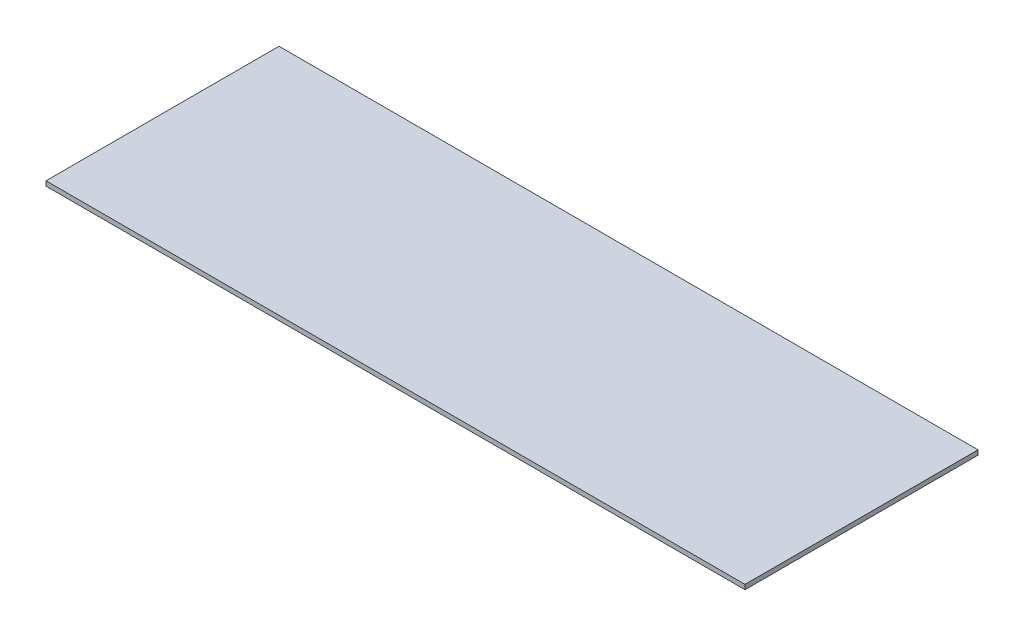
ISO-10303-21;
HEADER;
FILE_DESCRIPTION(('STEP AP214'),'2;1');
FILE_NAME('part.step','',(''),(''),'','','');
FILE_SCHEMA(('AUTOMOTIVE_DESIGN { 1 0 10303 214 1 1 1 1 }'));
ENDSEC;
DATA;
#1=APPLICATION_CONTEXT('core data for automotive mechanical design processes');
#2=APPLICATION_PROTOCOL_DEFINITION('international standard','automotive_design',2000,#1);
#3=PRODUCT_CONTEXT('',#1,'mechanical');
#4=PRODUCT('Part','Part','',(#3));
#5=PRODUCT_RELATED_PRODUCT_CATEGORY('part','',(#4));
#6=PRODUCT_DEFINITION_FORMATION('','',#4);
#7=PRODUCT_DEFINITION_CONTEXT('part definition',#1,'design');
#8=PRODUCT_DEFINITION('design','',#6,#7);
#9=PRODUCT_DEFINITION_SHAPE('','',#8);
#10=(LENGTH_UNIT() NAMED_UNIT(*) SI_UNIT(.MILLI.,.METRE.));
#11=(NAMED_UNIT(*) PLANE_ANGLE_UNIT() SI_UNIT($,.RADIAN.));
#12=(NAMED_UNIT(*) SI_UNIT($,.STERADIAN.) SOLID_ANGLE_UNIT());
#13=UNCERTAINTY_MEASURE_WITH_UNIT(LENGTH_MEASURE(1.E-05),#10,'distance_accuracy_value','');
#14=(GEOMETRIC_REPRESENTATION_CONTEXT(3) GLOBAL_UNCERTAINTY_ASSIGNED_CONTEXT((#13)) GLOBAL_UNIT_ASSIGNED_CONTEXT((#10,
#11,#12)) REPRESENTATION_CONTEXT('',''));
#15=CARTESIAN_POINT('',(0.,0.,0.));
#16=DIRECTION('',(0.,0.,1.));
#17=DIRECTION('',(1.,0.,0.));
#18=AXIS2_PLACEMENT_3D('',#15,#16,#17);
#19=CARTESIAN_POINT('',(15.,0.2,-5.));
#20=DIRECTION('',(-1.,0.,0.));
#21=DIRECTION('',(0.,0.,1.));
#22=AXIS2_PLACEMENT_3D('',#19,#20,#21);
#23=PLANE('',#22);
#24=DIRECTION('',(0.,0.,-1.));
#25=VECTOR('',#24,1.);
#26=CARTESIAN_POINT('',(15.,0.,-5.));
#27=LINE('',#26,#25);
#28=CARTESIAN_POINT('',(15.,0.,5.));
#29=VERTEX_POINT('',#28);
#30=CARTESIAN_POINT('',(15.,0.,-5.));
#31=VERTEX_POINT('',#30);
#32=EDGE_CURVE('E112',#29,#31,#27,.T.);
#33=ORIENTED_EDGE('',*,*,#32,.T.);
#34=DIRECTION('',(0.,-1.,0.));
#35=VECTOR('',#34,1.);
#36=CARTESIAN_POINT('',(15.,0.2,-5.));
#37=LINE('',#36,#35);
#38=CARTESIAN_POINT('',(15.,0.2,-5.));
#39=VERTEX_POINT('',#38);
#40=EDGE_CURVE('E11',#39,#31,#37,.T.);
#41=ORIENTED_EDGE('',*,*,#40,.F.);
#42=DIRECTION('',(0.,0.,-1.));
#43=VECTOR('',#42,1.);
#44=CARTESIAN_POINT('',(15.,0.2,-5.));
#45=LINE('',#44,#43);
#46=CARTESIAN_POINT('',(15.,0.2,5.));
#47=VERTEX_POINT('',#46);
#48=EDGE_CURVE('E95',#47,#39,#45,.T.);
#49=ORIENTED_EDGE('',*,*,#48,.F.);
#50=DIRECTION('',(0.,-1.,0.));
#51=VECTOR('',#50,1.);
#52=CARTESIAN_POINT('',(15.,0.2,5.));
#53=LINE('',#52,#51);
#54=EDGE_CURVE('E108',#47,#29,#53,.T.);
#55=ORIENTED_EDGE('',*,*,#54,.T.);
#56=EDGE_LOOP('',(#33,#41,#49,#55));
#57=FACE_BOUND('',#56,.T.);
#58=ADVANCED_FACE('F43',(#57),#23,.F.);
#59=CARTESIAN_POINT('',(-15.,0.2,-5.));
#60=DIRECTION('',(0.,0.,1.));
#61=DIRECTION('',(1.,0.,0.));
#62=AXIS2_PLACEMENT_3D('',#59,#60,#61);
#63=PLANE('',#62);
#64=DIRECTION('',(-1.,0.,0.));
#65=VECTOR('',#64,1.);
#66=CARTESIAN_POINT('',(-15.,0.,-5.));
#67=LINE('',#66,#65);
#68=CARTESIAN_POINT('',(-15.,0.,-5.));
#69=VERTEX_POINT('',#68);
#70=EDGE_CURVE('E100',#31,#69,#67,.T.);
#71=ORIENTED_EDGE('',*,*,#70,.T.);
#72=DIRECTION('',(0.,-1.,0.));
#73=VECTOR('',#72,1.);
#74=CARTESIAN_POINT('',(-15.,0.2,-5.));
#75=LINE('',#74,#73);
#76=CARTESIAN_POINT('',(-15.,0.2,-5.));
#77=VERTEX_POINT('',#76);
#78=EDGE_CURVE('E52',#77,#69,#75,.T.);
#79=ORIENTED_EDGE('',*,*,#78,.F.);
#80=DIRECTION('',(-1.,0.,0.));
#81=VECTOR('',#80,1.);
#82=CARTESIAN_POINT('',(-15.,0.2,-5.));
#83=LINE('',#82,#81);
#84=EDGE_CURVE('E90',#39,#77,#83,.T.);
#85=ORIENTED_EDGE('',*,*,#84,.F.);
#86=ORIENTED_EDGE('',*,*,#40,.T.);
#87=EDGE_LOOP('',(#71,#79,#85,#86));
#88=FACE_BOUND('',#87,.T.);
#89=ADVANCED_FACE('F99',(#88),#63,.F.);
#90=CARTESIAN_POINT('',(-15.,0.2,-5.));
#91=DIRECTION('',(1.,0.,0.));
#92=DIRECTION('',(0.,0.,-1.));
#93=AXIS2_PLACEMENT_3D('',#90,#91,#92);
#94=PLANE('',#93);
#95=DIRECTION('',(0.,0.,1.));
#96=VECTOR('',#95,1.);
#97=CARTESIAN_POINT('',(-15.,0.,-5.));
#98=LINE('',#97,#96);
#99=CARTESIAN_POINT('',(-15.,0.,5.));
#100=VERTEX_POINT('',#99);
#101=EDGE_CURVE('E77',#69,#100,#98,.T.);
#102=ORIENTED_EDGE('',*,*,#101,.T.);
#103=DIRECTION('',(0.,-1.,0.));
#104=VECTOR('',#103,1.);
#105=CARTESIAN_POINT('',(-15.,0.2,5.));
#106=LINE('',#105,#104);
#107=CARTESIAN_POINT('',(-15.,0.2,5.));
#108=VERTEX_POINT('',#107);
#109=EDGE_CURVE('E102',#108,#100,#106,.T.);
#110=ORIENTED_EDGE('',*,*,#109,.F.);
#111=DIRECTION('',(0.,0.,1.));
#112=VECTOR('',#111,1.);
#113=CARTESIAN_POINT('',(-15.,0.2,-5.));
#114=LINE('',#113,#112);
#115=EDGE_CURVE('E93',#77,#108,#114,.T.);
#116=ORIENTED_EDGE('',*,*,#115,.F.);
#117=ORIENTED_EDGE('',*,*,#78,.T.);
#118=EDGE_LOOP('',(#102,#110,#116,#117));
#119=FACE_BOUND('',#118,.T.);
#120=ADVANCED_FACE('F103',(#119),#94,.F.);
#121=CARTESIAN_POINT('',(-15.,0.2,5.));
#122=DIRECTION('',(0.,0.,-1.));
#123=DIRECTION('',(-1.,0.,0.));
#124=AXIS2_PLACEMENT_3D('',#121,#122,#123);
#125=PLANE('',#124);
#126=DIRECTION('',(1.,0.,0.));
#127=VECTOR('',#126,1.);
#128=CARTESIAN_POINT('',(-15.,0.,5.));
#129=LINE('',#128,#127);
#130=EDGE_CURVE('E83',#100,#29,#129,.T.);
#131=ORIENTED_EDGE('',*,*,#130,.T.);
#132=ORIENTED_EDGE('',*,*,#54,.F.);
#133=DIRECTION('',(1.,0.,0.));
#134=VECTOR('',#133,1.);
#135=CARTESIAN_POINT('',(-15.,0.2,5.));
#136=LINE('',#135,#134);
#137=EDGE_CURVE('E60',#108,#47,#136,.T.);
#138=ORIENTED_EDGE('',*,*,#137,.F.);
#139=ORIENTED_EDGE('',*,*,#109,.T.);
#140=EDGE_LOOP('',(#131,#132,#138,#139));
#141=FACE_BOUND('',#140,.T.);
#142=ADVANCED_FACE('F126',(#141),#125,.F.);
#143=CARTESIAN_POINT('',(0.,0.2,0.));
#144=DIRECTION('',(0.,1.,0.));
#145=DIRECTION('',(0.,0.,1.));
#146=AXIS2_PLACEMENT_3D('',#143,#144,#145);
#147=PLANE('',#146);
#148=ORIENTED_EDGE('',*,*,#48,.T.);
#149=ORIENTED_EDGE('',*,*,#84,.T.);
#150=ORIENTED_EDGE('',*,*,#115,.T.);
#151=ORIENTED_EDGE('',*,*,#137,.T.);
#152=EDGE_LOOP('',(#148,#149,#150,#151));
#153=FACE_BOUND('',#152,.T.);
#154=ADVANCED_FACE('F91',(#153),#147,.T.);
#155=CARTESIAN_POINT('',(0.,0.,0.));
#156=DIRECTION('',(0.,1.,0.));
#157=DIRECTION('',(0.,0.,1.));
#158=AXIS2_PLACEMENT_3D('',#155,#156,#157);
#159=PLANE('',#158);
#160=ORIENTED_EDGE('',*,*,#32,.F.);
#161=ORIENTED_EDGE('',*,*,#130,.F.);
#162=ORIENTED_EDGE('',*,*,#101,.F.);
#163=ORIENTED_EDGE('',*,*,#70,.F.);
#164=EDGE_LOOP('',(#160,#161,#162,#163));
#165=FACE_BOUND('',#164,.T.);
#166=ADVANCED_FACE('F129',(#165),#159,.F.);
#167=CLOSED_SHELL('',(#58,#89,#120,#142,#154,#166));
#168=MANIFOLD_SOLID_BREP('B2',#167);
#169=ADVANCED_BREP_SHAPE_REPRESENTATION('',(#18,#168),#14);
#170=SHAPE_DEFINITION_REPRESENTATION(#9,#169);
ENDSEC;
END-ISO-10303-21;
